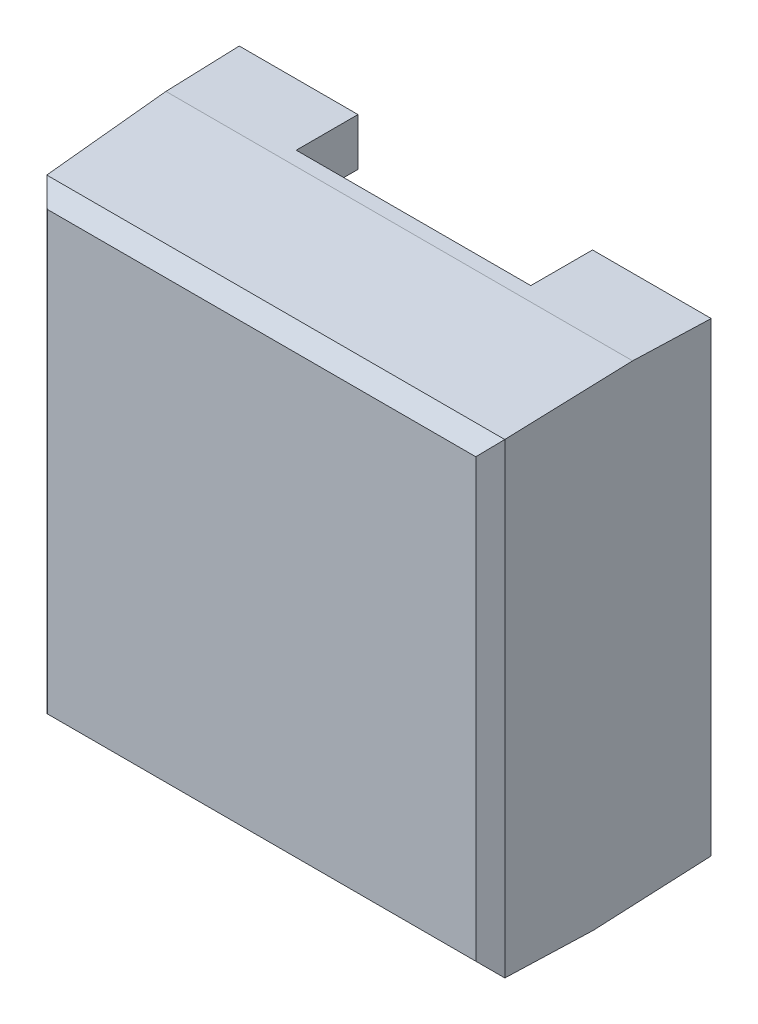
ISO-10303-21;
HEADER;
FILE_DESCRIPTION(('STEP AP214'),'2;1');
FILE_NAME('part.step','',(''),(''),'','','');
FILE_SCHEMA(('AUTOMOTIVE_DESIGN { 1 0 10303 214 1 1 1 1 }'));
ENDSEC;
DATA;
#1=APPLICATION_CONTEXT('core data for automotive mechanical design processes');
#2=APPLICATION_PROTOCOL_DEFINITION('international standard','automotive_design',2000,#1);
#3=PRODUCT_CONTEXT('',#1,'mechanical');
#4=PRODUCT('Part','Part','',(#3));
#5=PRODUCT_RELATED_PRODUCT_CATEGORY('part','',(#4));
#6=PRODUCT_DEFINITION_FORMATION('','',#4);
#7=PRODUCT_DEFINITION_CONTEXT('part definition',#1,'design');
#8=PRODUCT_DEFINITION('design','',#6,#7);
#9=PRODUCT_DEFINITION_SHAPE('','',#8);
#10=(LENGTH_UNIT() NAMED_UNIT(*) SI_UNIT(.MILLI.,.METRE.));
#11=(NAMED_UNIT(*) PLANE_ANGLE_UNIT() SI_UNIT($,.RADIAN.));
#12=(NAMED_UNIT(*) SI_UNIT($,.STERADIAN.) SOLID_ANGLE_UNIT());
#13=UNCERTAINTY_MEASURE_WITH_UNIT(LENGTH_MEASURE(1.E-05),#10,'distance_accuracy_value','');
#14=(GEOMETRIC_REPRESENTATION_CONTEXT(3) GLOBAL_UNCERTAINTY_ASSIGNED_CONTEXT((#13)) GLOBAL_UNIT_ASSIGNED_CONTEXT((#10,
#11,#12)) REPRESENTATION_CONTEXT('',''));
#15=CARTESIAN_POINT('',(0.,0.,0.));
#16=DIRECTION('',(0.,0.,1.));
#17=DIRECTION('',(1.,0.,0.));
#18=AXIS2_PLACEMENT_3D('',#15,#16,#17);
#19=CARTESIAN_POINT('',(0.,0.,4.5));
#20=DIRECTION('',(0.,1.,0.));
#21=DIRECTION('',(0.,0.,1.));
#22=AXIS2_PLACEMENT_3D('',#19,#20,#21);
#23=PLANE('',#22);
#24=DIRECTION('',(0.0348994967025091,0.,0.999390827019096));
#25=VECTOR('',#24,1.);
#26=CARTESIAN_POINT('',(0.187873739865646,0.,4.5));
#27=LINE('',#26,#25);
#28=CARTESIAN_POINT('',(0.17739750901812,0.,4.2));
#29=VERTEX_POINT('',#28);
#30=CARTESIAN_POINT('',(0.114540123932963,0.,2.4000000000001));
#31=VERTEX_POINT('',#30);
#32=EDGE_CURVE('E199',#29,#31,#27,.F.);
#33=ORIENTED_EDGE('',*,*,#32,.T.);
#34=DIRECTION('',(1.,0.,0.));
#35=VECTOR('',#34,1.);
#36=CARTESIAN_POINT('',(9.96926972284725,0.,2.4000000000001));
#37=LINE('',#36,#35);
#38=CARTESIAN_POINT('',(9.88545987606704,0.,2.4000000000001));
#39=VERTEX_POINT('',#38);
#40=EDGE_CURVE('E242',#31,#39,#37,.T.);
#41=ORIENTED_EDGE('',*,*,#40,.T.);
#42=DIRECTION('',(0.034899496702509,0.,-0.999390827019096));
#43=VECTOR('',#42,1.);
#44=CARTESIAN_POINT('',(9.81212626013435,0.,4.5));
#45=LINE('',#44,#43);
#46=CARTESIAN_POINT('',(9.82260249098188,0.,4.2));
#47=VERTEX_POINT('',#46);
#48=EDGE_CURVE('E197',#39,#47,#45,.F.);
#49=ORIENTED_EDGE('',*,*,#48,.T.);
#50=DIRECTION('',(-1.,0.,0.));
#51=VECTOR('',#50,1.);
#52=CARTESIAN_POINT('',(0.,0.,4.2));
#53=LINE('',#52,#51);
#54=EDGE_CURVE('E240',#47,#29,#53,.T.);
#55=ORIENTED_EDGE('',*,*,#54,.T.);
#56=EDGE_LOOP('',(#33,#41,#49,#55));
#57=FACE_BOUND('',#56,.T.);
#58=ADVANCED_FACE('F34',(#57),#23,.F.);
#59=CARTESIAN_POINT('',(0.,10.,4.5));
#60=DIRECTION('',(0.,-1.,0.));
#61=DIRECTION('',(0.,0.,-1.));
#62=AXIS2_PLACEMENT_3D('',#59,#60,#61);
#63=PLANE('',#62);
#64=DIRECTION('',(1.,0.,0.));
#65=VECTOR('',#64,1.);
#66=CARTESIAN_POINT('',(2.53073027715274,10.,1.3));
#67=LINE('',#66,#65);
#68=CARTESIAN_POINT('',(2.53073027715274,10.,1.3));
#69=VERTEX_POINT('',#68);
#70=CARTESIAN_POINT('',(7.46926972284725,10.,1.3));
#71=VERTEX_POINT('',#70);
#72=EDGE_CURVE('E169',#69,#71,#67,.T.);
#73=ORIENTED_EDGE('',*,*,#72,.F.);
#74=DIRECTION('',(0.,0.,-1.));
#75=VECTOR('',#74,1.);
#76=CARTESIAN_POINT('',(2.53073027715274,10.,1.3));
#77=LINE('',#76,#75);
#78=CARTESIAN_POINT('',(2.53073027715274,10.,0.));
#79=VERTEX_POINT('',#78);
#80=EDGE_CURVE('E246',#69,#79,#77,.T.);
#81=ORIENTED_EDGE('',*,*,#80,.T.);
#82=DIRECTION('',(-1.,0.,0.));
#83=VECTOR('',#82,1.);
#84=CARTESIAN_POINT('',(0.,10.,0.));
#85=LINE('',#84,#83);
#86=CARTESIAN_POINT('',(0.0307302771527434,10.,0.));
#87=VERTEX_POINT('',#86);
#88=EDGE_CURVE('E194',#79,#87,#85,.T.);
#89=ORIENTED_EDGE('',*,*,#88,.T.);
#90=DIRECTION('',(-0.0348994967025091,0.,-0.999390827019096));
#91=VECTOR('',#90,1.);
#92=CARTESIAN_POINT('',(0.187873739865645,10.,4.5));
#93=LINE('',#92,#91);
#94=CARTESIAN_POINT('',(0.0866035083395477,10.,1.59999999999986));
#95=VERTEX_POINT('',#94);
#96=EDGE_CURVE('E208',#87,#95,#93,.F.);
#97=ORIENTED_EDGE('',*,*,#96,.T.);
#98=DIRECTION('',(1.,0.,0.));
#99=VECTOR('',#98,1.);
#100=CARTESIAN_POINT('',(0.,10.,1.59999999999986));
#101=LINE('',#100,#99);
#102=CARTESIAN_POINT('',(9.91339649166045,10.,1.59999999999986));
#103=VERTEX_POINT('',#102);
#104=EDGE_CURVE('E193',#95,#103,#101,.T.);
#105=ORIENTED_EDGE('',*,*,#104,.T.);
#106=DIRECTION('',(-0.034899496702509,0.,0.999390827019096));
#107=VECTOR('',#106,1.);
#108=CARTESIAN_POINT('',(9.81212626013435,10.,4.5));
#109=LINE('',#108,#107);
#110=CARTESIAN_POINT('',(9.96926972284725,10.,0.));
#111=VERTEX_POINT('',#110);
#112=EDGE_CURVE('E206',#103,#111,#109,.F.);
#113=ORIENTED_EDGE('',*,*,#112,.T.);
#114=CARTESIAN_POINT('',(7.46926972284725,10.,0.));
#115=VERTEX_POINT('',#114);
#116=EDGE_CURVE('E184',#111,#115,#85,.T.);
#117=ORIENTED_EDGE('',*,*,#116,.T.);
#118=DIRECTION('',(0.,0.,-1.));
#119=VECTOR('',#118,1.);
#120=CARTESIAN_POINT('',(7.46926972284725,10.,1.3));
#121=LINE('',#120,#119);
#122=EDGE_CURVE('E162',#71,#115,#121,.T.);
#123=ORIENTED_EDGE('',*,*,#122,.F.);
#124=EDGE_LOOP('',(#73,#81,#89,#97,#105,#113,#117,#123));
#125=FACE_BOUND('',#124,.T.);
#126=ADVANCED_FACE('F182',(#125),#63,.F.);
#127=CARTESIAN_POINT('',(0.,0.,4.5));
#128=DIRECTION('',(0.,0.,-1.));
#129=DIRECTION('',(-1.,0.,0.));
#130=AXIS2_PLACEMENT_3D('',#127,#128,#129);
#131=PLANE('',#130);
#132=DIRECTION('',(-1.,0.,0.));
#133=VECTOR('',#132,1.);
#134=CARTESIAN_POINT('',(0.187873739865645,9.49999999999999,4.5));
#135=LINE('',#134,#133);
#136=CARTESIAN_POINT('',(9.51212626013435,9.49999999999999,4.5));
#137=VERTEX_POINT('',#136);
#138=CARTESIAN_POINT('',(0.487873739865643,9.49999999999999,4.5));
#139=VERTEX_POINT('',#138);
#140=EDGE_CURVE('E215',#137,#139,#135,.T.);
#141=ORIENTED_EDGE('',*,*,#140,.T.);
#142=DIRECTION('',(0.,-1.,0.));
#143=VECTOR('',#142,1.);
#144=CARTESIAN_POINT('',(0.487873739865645,0.,4.5));
#145=LINE('',#144,#143);
#146=CARTESIAN_POINT('',(0.487873739865645,0.300000000000002,4.5));
#147=VERTEX_POINT('',#146);
#148=EDGE_CURVE('E221',#139,#147,#145,.T.);
#149=ORIENTED_EDGE('',*,*,#148,.T.);
#150=DIRECTION('',(1.,0.,0.));
#151=VECTOR('',#150,1.);
#152=CARTESIAN_POINT('',(0.,0.300000000000002,4.5));
#153=LINE('',#152,#151);
#154=CARTESIAN_POINT('',(9.51212626013435,0.300000000000002,4.5));
#155=VERTEX_POINT('',#154);
#156=EDGE_CURVE('E219',#147,#155,#153,.T.);
#157=ORIENTED_EDGE('',*,*,#156,.T.);
#158=DIRECTION('',(0.,1.,0.));
#159=VECTOR('',#158,1.);
#160=CARTESIAN_POINT('',(9.51212626013435,9.8,4.5));
#161=LINE('',#160,#159);
#162=EDGE_CURVE('E217',#155,#137,#161,.T.);
#163=ORIENTED_EDGE('',*,*,#162,.T.);
#164=EDGE_LOOP('',(#141,#149,#157,#163));
#165=FACE_BOUND('',#164,.T.);
#166=ADVANCED_FACE('F286',(#165),#131,.F.);
#167=CARTESIAN_POINT('',(0.,0.,0.));
#168=DIRECTION('',(0.,0.,-1.));
#169=DIRECTION('',(-1.,0.,0.));
#170=AXIS2_PLACEMENT_3D('',#167,#168,#169);
#171=PLANE('',#170);
#172=DIRECTION('',(0.,1.,0.));
#173=VECTOR('',#172,1.);
#174=CARTESIAN_POINT('',(9.96926972284725,0.,0.));
#175=LINE('',#174,#173);
#176=CARTESIAN_POINT('',(9.96926972284725,0.2,0.));
#177=VERTEX_POINT('',#176);
#178=EDGE_CURVE('E202',#111,#177,#175,.F.);
#179=ORIENTED_EDGE('',*,*,#178,.T.);
#180=DIRECTION('',(-1.,0.,0.));
#181=VECTOR('',#180,1.);
#182=CARTESIAN_POINT('',(0.0307302771527443,0.2,0.));
#183=LINE('',#182,#181);
#184=CARTESIAN_POINT('',(0.0307302771527451,0.2,0.));
#185=VERTEX_POINT('',#184);
#186=EDGE_CURVE('E42',#177,#185,#183,.T.);
#187=ORIENTED_EDGE('',*,*,#186,.T.);
#188=DIRECTION('',(0.,-1.,0.));
#189=VECTOR('',#188,1.);
#190=CARTESIAN_POINT('',(0.0307302771527452,0.,0.));
#191=LINE('',#190,#189);
#192=EDGE_CURVE('E204',#185,#87,#191,.F.);
#193=ORIENTED_EDGE('',*,*,#192,.T.);
#194=ORIENTED_EDGE('',*,*,#88,.F.);
#195=DIRECTION('',(0.,1.,0.));
#196=VECTOR('',#195,1.);
#197=CARTESIAN_POINT('',(2.53073027715274,9.,0.));
#198=LINE('',#197,#196);
#199=CARTESIAN_POINT('',(2.53073027715274,9.,0.));
#200=VERTEX_POINT('',#199);
#201=EDGE_CURVE('E179',#200,#79,#198,.T.);
#202=ORIENTED_EDGE('',*,*,#201,.F.);
#203=DIRECTION('',(1.,0.,0.));
#204=VECTOR('',#203,1.);
#205=CARTESIAN_POINT('',(2.03073027715274,9.,0.));
#206=LINE('',#205,#204);
#207=CARTESIAN_POINT('',(2.03073027715274,9.,0.));
#208=VERTEX_POINT('',#207);
#209=EDGE_CURVE('E345',#208,#200,#206,.T.);
#210=ORIENTED_EDGE('',*,*,#209,.F.);
#211=DIRECTION('',(0.0995037190209989,0.995037190209989,0.));
#212=VECTOR('',#211,1.);
#213=CARTESIAN_POINT('',(1.53073027715274,4.,0.));
#214=LINE('',#213,#212);
#215=CARTESIAN_POINT('',(1.53073027715274,4.,0.));
#216=VERTEX_POINT('',#215);
#217=EDGE_CURVE('E342',#216,#208,#214,.T.);
#218=ORIENTED_EDGE('',*,*,#217,.F.);
#219=DIRECTION('',(-1.,0.,0.));
#220=VECTOR('',#219,1.);
#221=CARTESIAN_POINT('',(8.46926972284725,4.,0.));
#222=LINE('',#221,#220);
#223=CARTESIAN_POINT('',(8.46926972284725,4.,0.));
#224=VERTEX_POINT('',#223);
#225=EDGE_CURVE('E339',#224,#216,#222,.T.);
#226=ORIENTED_EDGE('',*,*,#225,.F.);
#227=DIRECTION('',(0.099503719020999,-0.995037190209989,0.));
#228=VECTOR('',#227,1.);
#229=CARTESIAN_POINT('',(7.96926972284725,9.,0.));
#230=LINE('',#229,#228);
#231=CARTESIAN_POINT('',(7.96926972284725,9.,0.));
#232=VERTEX_POINT('',#231);
#233=EDGE_CURVE('E333',#232,#224,#230,.T.);
#234=ORIENTED_EDGE('',*,*,#233,.F.);
#235=DIRECTION('',(1.,0.,0.));
#236=VECTOR('',#235,1.);
#237=CARTESIAN_POINT('',(7.46926972284725,9.,0.));
#238=LINE('',#237,#236);
#239=CARTESIAN_POINT('',(7.46926972284725,9.,0.));
#240=VERTEX_POINT('',#239);
#241=EDGE_CURVE('E331',#240,#232,#238,.T.);
#242=ORIENTED_EDGE('',*,*,#241,.F.);
#243=DIRECTION('',(0.,-1.,0.));
#244=VECTOR('',#243,1.);
#245=CARTESIAN_POINT('',(7.46926972284725,10.,0.));
#246=LINE('',#245,#244);
#247=EDGE_CURVE('E328',#115,#240,#246,.T.);
#248=ORIENTED_EDGE('',*,*,#247,.F.);
#249=ORIENTED_EDGE('',*,*,#116,.F.);
#250=EDGE_LOOP('',(#179,#187,#193,#194,#202,#210,#218,#226,#234,#242,#248,#249));
#251=FACE_BOUND('',#250,.T.);
#252=ADVANCED_FACE('F293',(#251),#171,.T.);
#253=CARTESIAN_POINT('',(0.,9.8,4.5));
#254=DIRECTION('',(0.,-0.997630328422983,-0.0688020916153749));
#255=DIRECTION('',(-1.,0.,0.));
#256=AXIS2_PLACEMENT_3D('',#253,#254,#255);
#257=PLANE('',#256);
#258=DIRECTION('',(0.0348168967267456,-0.0687603774615119,0.997025473191969));
#259=VECTOR('',#258,1.);
#260=CARTESIAN_POINT('',(0.187645996256273,9.800449774047,4.49347827631848));
#261=LINE('',#260,#259);
#262=CARTESIAN_POINT('',(0.177403890854892,9.8206770515935,4.20018275189427));
#263=VERTEX_POINT('',#262);
#264=EDGE_CURVE('E212',#95,#263,#261,.T.);
#265=ORIENTED_EDGE('',*,*,#264,.T.);
#266=DIRECTION('',(0.718515730818567,-0.0478525914326729,0.69386257577379));
#267=VECTOR('',#266,1.);
#268=CARTESIAN_POINT('',(0.236001674083989,9.81677448459399,4.25676997338719));
#269=LINE('',#268,#267);
#270=CARTESIAN_POINT('',(0.177950805753989,9.82064062748461,4.2007109014731));
#271=VERTEX_POINT('',#270);
#272=EDGE_CURVE('E233',#263,#271,#269,.T.);
#273=ORIENTED_EDGE('',*,*,#272,.T.);
#274=DIRECTION('',(-1.,0.,0.));
#275=VECTOR('',#274,1.);
#276=CARTESIAN_POINT('',(9.81212626013435,9.82064062748461,4.2007109014731));
#277=LINE('',#276,#275);
#278=CARTESIAN_POINT('',(9.82204919424601,9.82064062748461,4.2007109014731));
#279=VERTEX_POINT('',#278);
#280=EDGE_CURVE('E229',#271,#279,#277,.F.);
#281=ORIENTED_EDGE('',*,*,#280,.T.);
#282=DIRECTION('',(0.718515730818572,0.0478525914326725,-0.693862575773784));
#283=VECTOR('',#282,1.);
#284=CARTESIAN_POINT('',(4.60134977157854,9.47294608754589,9.24228173058476));
#285=LINE('',#284,#283);
#286=CARTESIAN_POINT('',(9.82259610914511,9.8206770515935,4.20018275189427));
#287=VERTEX_POINT('',#286);
#288=EDGE_CURVE('E231',#279,#287,#285,.T.);
#289=ORIENTED_EDGE('',*,*,#288,.T.);
#290=DIRECTION('',(0.0348168967267455,0.0687603774615119,-0.997025473191969));
#291=VECTOR('',#290,1.);
#292=CARTESIAN_POINT('',(9.80023184076691,9.77650954443731,4.84061160565907));
#293=LINE('',#292,#291);
#294=EDGE_CURVE('E210',#287,#103,#293,.T.);
#295=ORIENTED_EDGE('',*,*,#294,.T.);
#296=ORIENTED_EDGE('',*,*,#104,.F.);
#297=EDGE_LOOP('',(#265,#273,#281,#289,#295,#296));
#298=FACE_BOUND('',#297,.T.);
#299=ADVANCED_FACE('F290',(#298),#257,.F.);
#300=CARTESIAN_POINT('',(0.187873739865646,0.,4.5));
#301=DIRECTION('',(0.999390827019096,0.,-0.0348994967025091));
#302=DIRECTION('',(0.,-1.,0.));
#303=AXIS2_PLACEMENT_3D('',#300,#301,#302);
#304=PLANE('',#303);
#305=ORIENTED_EDGE('',*,*,#192,.F.);
#306=DIRECTION('',(-0.0347790914732437,0.0829952393647687,-0.995942872377267));
#307=VECTOR('',#306,1.);
#308=CARTESIAN_POINT('',(0.187368602536847,-0.173794563292472,4.48553475950985));
#309=LINE('',#308,#307);
#310=EDGE_CURVE('E11',#185,#31,#309,.F.);
#311=ORIENTED_EDGE('',*,*,#310,.T.);
#312=ORIENTED_EDGE('',*,*,#32,.F.);
#313=DIRECTION('',(0.0246851884078374,0.706891307583164,0.706891307583164));
#314=VECTOR('',#313,1.);
#315=CARTESIAN_POINT('',(0.18263881633218,0.15009140377901,4.35009140377901));
#316=LINE('',#315,#314);
#317=CARTESIAN_POINT('',(0.177403890854894,0.000182751894272157,4.20018275189427));
#318=VERTEX_POINT('',#317);
#319=EDGE_CURVE('E224',#29,#318,#316,.T.);
#320=ORIENTED_EDGE('',*,*,#319,.T.);
#321=DIRECTION('',(0.,-1.,0.));
#322=VECTOR('',#321,1.);
#323=CARTESIAN_POINT('',(0.177403890854892,9.8,4.20018275189427));
#324=LINE('',#323,#322);
#325=EDGE_CURVE('E226',#318,#263,#324,.F.);
#326=ORIENTED_EDGE('',*,*,#325,.T.);
#327=ORIENTED_EDGE('',*,*,#264,.F.);
#328=ORIENTED_EDGE('',*,*,#96,.F.);
#329=EDGE_LOOP('',(#305,#311,#312,#320,#326,#327,#328));
#330=FACE_BOUND('',#329,.T.);
#331=ADVANCED_FACE('F273',(#330),#304,.F.);
#332=CARTESIAN_POINT('',(9.81212626013435,0.,4.5));
#333=DIRECTION('',(-0.999390827019096,0.,-0.034899496702509));
#334=DIRECTION('',(0.,1.,0.));
#335=AXIS2_PLACEMENT_3D('',#332,#333,#334);
#336=PLANE('',#335);
#337=ORIENTED_EDGE('',*,*,#48,.F.);
#338=DIRECTION('',(-0.0347790914732436,-0.0829952393647687,0.995942872377267));
#339=VECTOR('',#338,1.);
#340=CARTESIAN_POINT('',(9.81263139746315,-0.173794563292472,4.48553475950985));
#341=LINE('',#340,#339);
#342=EDGE_CURVE('E56',#39,#177,#341,.F.);
#343=ORIENTED_EDGE('',*,*,#342,.T.);
#344=ORIENTED_EDGE('',*,*,#178,.F.);
#345=ORIENTED_EDGE('',*,*,#112,.F.);
#346=ORIENTED_EDGE('',*,*,#294,.F.);
#347=DIRECTION('',(0.,1.,0.));
#348=VECTOR('',#347,1.);
#349=CARTESIAN_POINT('',(9.82259610914511,0.,4.20018275189427));
#350=LINE('',#349,#348);
#351=CARTESIAN_POINT('',(9.82259610914511,0.000182751894272144,4.20018275189427));
#352=VERTEX_POINT('',#351);
#353=EDGE_CURVE('E235',#287,#352,#350,.F.);
#354=ORIENTED_EDGE('',*,*,#353,.T.);
#355=DIRECTION('',(0.0246851884078376,-0.706891307583164,-0.706891307583164));
#356=VECTOR('',#355,1.);
#357=CARTESIAN_POINT('',(9.81736118366782,0.150091403779011,4.35009140377901));
#358=LINE('',#357,#356);
#359=EDGE_CURVE('E237',#352,#47,#358,.T.);
#360=ORIENTED_EDGE('',*,*,#359,.T.);
#361=EDGE_LOOP('',(#337,#343,#344,#345,#346,#354,#360));
#362=FACE_BOUND('',#361,.T.);
#363=ADVANCED_FACE('F262',(#362),#336,.F.);
#364=CARTESIAN_POINT('',(9.51212626013435,0.,4.5));
#365=DIRECTION('',(-0.694658370458991,0.,-0.719339800338657));
#366=DIRECTION('',(0.,1.,0.));
#367=AXIS2_PLACEMENT_3D('',#364,#365,#366);
#368=PLANE('',#367);
#369=ORIENTED_EDGE('',*,*,#353,.F.);
#370=ORIENTED_EDGE('',*,*,#288,.F.);
#371=DIRECTION('',(0.577070043374536,0.597026165038574,-0.557270063164211));
#372=VECTOR('',#371,1.);
#373=CARTESIAN_POINT('',(6.34449466412558,6.22282599706407,7.55894627498984));
#374=LINE('',#373,#372);
#375=EDGE_CURVE('E252',#137,#279,#374,.T.);
#376=ORIENTED_EDGE('',*,*,#375,.F.);
#377=ORIENTED_EDGE('',*,*,#162,.F.);
#378=DIRECTION('',(0.590784889178383,-0.570514335805195,-0.570514335805195));
#379=VECTOR('',#378,1.);
#380=CARTESIAN_POINT('',(9.61324163473036,0.202354017792229,4.40235401779223));
#381=LINE('',#380,#379);
#382=EDGE_CURVE('E249',#352,#155,#381,.F.);
#383=ORIENTED_EDGE('',*,*,#382,.F.);
#384=EDGE_LOOP('',(#369,#370,#376,#377,#383));
#385=FACE_BOUND('',#384,.T.);
#386=ADVANCED_FACE('F299',(#385),#368,.F.);
#387=CARTESIAN_POINT('',(0.,9.49999999999999,4.5));
#388=DIRECTION('',(0.,-0.682348118039691,-0.731027390600169));
#389=DIRECTION('',(-1.,0.,0.));
#390=AXIS2_PLACEMENT_3D('',#387,#388,#389);
#391=PLANE('',#390);
#392=ORIENTED_EDGE('',*,*,#375,.T.);
#393=ORIENTED_EDGE('',*,*,#280,.F.);
#394=DIRECTION('',(0.57707004337453,-0.597026165038577,0.557270063164214));
#395=VECTOR('',#394,1.);
#396=CARTESIAN_POINT('',(0.32540698627153,9.6680851466095,4.34310767977482));
#397=LINE('',#396,#395);
#398=EDGE_CURVE('E245',#139,#271,#397,.F.);
#399=ORIENTED_EDGE('',*,*,#398,.F.);
#400=ORIENTED_EDGE('',*,*,#140,.F.);
#401=EDGE_LOOP('',(#392,#393,#399,#400));
#402=FACE_BOUND('',#401,.T.);
#403=ADVANCED_FACE('F307',(#402),#391,.F.);
#404=CARTESIAN_POINT('',(0.,0.300000000000002,4.5));
#405=DIRECTION('',(0.,0.707106781186548,-0.707106781186548));
#406=DIRECTION('',(1.,0.,0.));
#407=AXIS2_PLACEMENT_3D('',#404,#405,#406);
#408=PLANE('',#407);
#409=ORIENTED_EDGE('',*,*,#382,.T.);
#410=ORIENTED_EDGE('',*,*,#156,.F.);
#411=DIRECTION('',(-0.590784889178376,-0.570514335805199,-0.570514335805199));
#412=VECTOR('',#411,1.);
#413=CARTESIAN_POINT('',(0.317592736817073,0.135561546793107,4.3355615467931));
#414=LINE('',#413,#412);
#415=EDGE_CURVE('E243',#318,#147,#414,.F.);
#416=ORIENTED_EDGE('',*,*,#415,.F.);
#417=ORIENTED_EDGE('',*,*,#319,.F.);
#418=ORIENTED_EDGE('',*,*,#54,.F.);
#419=ORIENTED_EDGE('',*,*,#359,.F.);
#420=EDGE_LOOP('',(#409,#410,#416,#417,#418,#419));
#421=FACE_BOUND('',#420,.T.);
#422=ADVANCED_FACE('F270',(#421),#408,.F.);
#423=CARTESIAN_POINT('',(0.487873739865645,0.,4.5));
#424=DIRECTION('',(0.694658370458997,0.,-0.719339800338651));
#425=DIRECTION('',(0.,-1.,0.));
#426=AXIS2_PLACEMENT_3D('',#423,#424,#425);
#427=PLANE('',#426);
#428=ORIENTED_EDGE('',*,*,#272,.F.);
#429=ORIENTED_EDGE('',*,*,#325,.F.);
#430=ORIENTED_EDGE('',*,*,#415,.T.);
#431=ORIENTED_EDGE('',*,*,#148,.F.);
#432=ORIENTED_EDGE('',*,*,#398,.T.);
#433=EDGE_LOOP('',(#428,#429,#430,#431,#432));
#434=FACE_BOUND('',#433,.T.);
#435=ADVANCED_FACE('F300',(#434),#427,.F.);
#436=CARTESIAN_POINT('',(2.53073027715274,9.,1.3));
#437=DIRECTION('',(-1.,0.,0.));
#438=DIRECTION('',(0.,0.,1.));
#439=AXIS2_PLACEMENT_3D('',#436,#437,#438);
#440=PLANE('',#439);
#441=ORIENTED_EDGE('',*,*,#201,.T.);
#442=ORIENTED_EDGE('',*,*,#80,.F.);
#443=DIRECTION('',(0.,1.,0.));
#444=VECTOR('',#443,1.);
#445=CARTESIAN_POINT('',(2.53073027715274,9.,1.3));
#446=LINE('',#445,#444);
#447=CARTESIAN_POINT('',(2.53073027715274,9.,1.3));
#448=VERTEX_POINT('',#447);
#449=EDGE_CURVE('E176',#448,#69,#446,.T.);
#450=ORIENTED_EDGE('',*,*,#449,.F.);
#451=DIRECTION('',(0.,0.,-1.));
#452=VECTOR('',#451,1.);
#453=CARTESIAN_POINT('',(2.53073027715274,9.,1.3));
#454=LINE('',#453,#452);
#455=EDGE_CURVE('E350',#448,#200,#454,.T.);
#456=ORIENTED_EDGE('',*,*,#455,.T.);
#457=EDGE_LOOP('',(#441,#442,#450,#456));
#458=FACE_BOUND('',#457,.T.);
#459=ADVANCED_FACE('F303',(#458),#440,.F.);
#460=CARTESIAN_POINT('',(2.03073027715274,9.,1.3));
#461=DIRECTION('',(0.,1.,0.));
#462=DIRECTION('',(0.,0.,1.));
#463=AXIS2_PLACEMENT_3D('',#460,#461,#462);
#464=PLANE('',#463);
#465=ORIENTED_EDGE('',*,*,#209,.T.);
#466=ORIENTED_EDGE('',*,*,#455,.F.);
#467=DIRECTION('',(1.,0.,0.));
#468=VECTOR('',#467,1.);
#469=CARTESIAN_POINT('',(2.03073027715274,9.,1.3));
#470=LINE('',#469,#468);
#471=CARTESIAN_POINT('',(2.03073027715274,9.,1.3));
#472=VERTEX_POINT('',#471);
#473=EDGE_CURVE('E188',#472,#448,#470,.T.);
#474=ORIENTED_EDGE('',*,*,#473,.F.);
#475=DIRECTION('',(0.,0.,-1.));
#476=VECTOR('',#475,1.);
#477=CARTESIAN_POINT('',(2.03073027715274,9.,1.3));
#478=LINE('',#477,#476);
#479=EDGE_CURVE('E352',#472,#208,#478,.T.);
#480=ORIENTED_EDGE('',*,*,#479,.T.);
#481=EDGE_LOOP('',(#465,#466,#474,#480));
#482=FACE_BOUND('',#481,.T.);
#483=ADVANCED_FACE('F384',(#482),#464,.F.);
#484=CARTESIAN_POINT('',(1.53073027715274,4.,1.3));
#485=DIRECTION('',(-0.995037190209989,0.0995037190209989,0.));
#486=DIRECTION('',(-0.0995037190209989,-0.995037190209989,0.));
#487=AXIS2_PLACEMENT_3D('',#484,#485,#486);
#488=PLANE('',#487);
#489=ORIENTED_EDGE('',*,*,#217,.T.);
#490=ORIENTED_EDGE('',*,*,#479,.F.);
#491=DIRECTION('',(0.0995037190209989,0.995037190209989,0.));
#492=VECTOR('',#491,1.);
#493=CARTESIAN_POINT('',(1.53073027715274,4.,1.3));
#494=LINE('',#493,#492);
#495=CARTESIAN_POINT('',(1.53073027715274,4.,1.3));
#496=VERTEX_POINT('',#495);
#497=EDGE_CURVE('E374',#496,#472,#494,.T.);
#498=ORIENTED_EDGE('',*,*,#497,.F.);
#499=DIRECTION('',(0.,0.,-1.));
#500=VECTOR('',#499,1.);
#501=CARTESIAN_POINT('',(1.53073027715274,4.,1.3));
#502=LINE('',#501,#500);
#503=EDGE_CURVE('E354',#496,#216,#502,.T.);
#504=ORIENTED_EDGE('',*,*,#503,.T.);
#505=EDGE_LOOP('',(#489,#490,#498,#504));
#506=FACE_BOUND('',#505,.T.);
#507=ADVANCED_FACE('F386',(#506),#488,.F.);
#508=CARTESIAN_POINT('',(8.46926972284725,4.,1.3));
#509=DIRECTION('',(0.,-1.,0.));
#510=DIRECTION('',(0.,0.,-1.));
#511=AXIS2_PLACEMENT_3D('',#508,#509,#510);
#512=PLANE('',#511);
#513=ORIENTED_EDGE('',*,*,#225,.T.);
#514=ORIENTED_EDGE('',*,*,#503,.F.);
#515=DIRECTION('',(-1.,0.,0.));
#516=VECTOR('',#515,1.);
#517=CARTESIAN_POINT('',(8.46926972284725,4.,1.3));
#518=LINE('',#517,#516);
#519=CARTESIAN_POINT('',(8.46926972284725,4.,1.3));
#520=VERTEX_POINT('',#519);
#521=EDGE_CURVE('E372',#520,#496,#518,.T.);
#522=ORIENTED_EDGE('',*,*,#521,.F.);
#523=DIRECTION('',(0.,0.,-1.));
#524=VECTOR('',#523,1.);
#525=CARTESIAN_POINT('',(8.46926972284725,4.,1.3));
#526=LINE('',#525,#524);
#527=EDGE_CURVE('E356',#520,#224,#526,.T.);
#528=ORIENTED_EDGE('',*,*,#527,.T.);
#529=EDGE_LOOP('',(#513,#514,#522,#528));
#530=FACE_BOUND('',#529,.T.);
#531=ADVANCED_FACE('F368',(#530),#512,.F.);
#532=CARTESIAN_POINT('',(7.96926972284725,9.,1.3));
#533=DIRECTION('',(0.995037190209989,0.099503719020999,0.));
#534=DIRECTION('',(-0.099503719020999,0.995037190209989,0.));
#535=AXIS2_PLACEMENT_3D('',#532,#533,#534);
#536=PLANE('',#535);
#537=ORIENTED_EDGE('',*,*,#233,.T.);
#538=ORIENTED_EDGE('',*,*,#527,.F.);
#539=DIRECTION('',(0.099503719020999,-0.995037190209989,0.));
#540=VECTOR('',#539,1.);
#541=CARTESIAN_POINT('',(7.96926972284725,9.,1.3));
#542=LINE('',#541,#540);
#543=CARTESIAN_POINT('',(7.96926972284725,9.,1.3));
#544=VERTEX_POINT('',#543);
#545=EDGE_CURVE('E362',#544,#520,#542,.T.);
#546=ORIENTED_EDGE('',*,*,#545,.F.);
#547=DIRECTION('',(0.,0.,-1.));
#548=VECTOR('',#547,1.);
#549=CARTESIAN_POINT('',(7.96926972284725,9.,1.3));
#550=LINE('',#549,#548);
#551=EDGE_CURVE('E186',#544,#232,#550,.T.);
#552=ORIENTED_EDGE('',*,*,#551,.T.);
#553=EDGE_LOOP('',(#537,#538,#546,#552));
#554=FACE_BOUND('',#553,.T.);
#555=ADVANCED_FACE('F359',(#554),#536,.F.);
#556=CARTESIAN_POINT('',(7.46926972284725,9.,1.3));
#557=DIRECTION('',(0.,1.,0.));
#558=DIRECTION('',(0.,0.,1.));
#559=AXIS2_PLACEMENT_3D('',#556,#557,#558);
#560=PLANE('',#559);
#561=ORIENTED_EDGE('',*,*,#241,.T.);
#562=ORIENTED_EDGE('',*,*,#551,.F.);
#563=DIRECTION('',(1.,0.,0.));
#564=VECTOR('',#563,1.);
#565=CARTESIAN_POINT('',(7.46926972284725,9.,1.3));
#566=LINE('',#565,#564);
#567=CARTESIAN_POINT('',(7.46926972284725,9.,1.3));
#568=VERTEX_POINT('',#567);
#569=EDGE_CURVE('E168',#568,#544,#566,.T.);
#570=ORIENTED_EDGE('',*,*,#569,.F.);
#571=DIRECTION('',(0.,0.,-1.));
#572=VECTOR('',#571,1.);
#573=CARTESIAN_POINT('',(7.46926972284725,9.,1.3));
#574=LINE('',#573,#572);
#575=EDGE_CURVE('E164',#568,#240,#574,.T.);
#576=ORIENTED_EDGE('',*,*,#575,.T.);
#577=EDGE_LOOP('',(#561,#562,#570,#576));
#578=FACE_BOUND('',#577,.T.);
#579=ADVANCED_FACE('F364',(#578),#560,.F.);
#580=CARTESIAN_POINT('',(7.46926972284725,10.,1.3));
#581=DIRECTION('',(1.,0.,0.));
#582=DIRECTION('',(0.,0.,-1.));
#583=AXIS2_PLACEMENT_3D('',#580,#581,#582);
#584=PLANE('',#583);
#585=ORIENTED_EDGE('',*,*,#247,.T.);
#586=ORIENTED_EDGE('',*,*,#575,.F.);
#587=DIRECTION('',(0.,-1.,0.));
#588=VECTOR('',#587,1.);
#589=CARTESIAN_POINT('',(7.46926972284725,10.,1.3));
#590=LINE('',#589,#588);
#591=EDGE_CURVE('E157',#71,#568,#590,.T.);
#592=ORIENTED_EDGE('',*,*,#591,.F.);
#593=ORIENTED_EDGE('',*,*,#122,.T.);
#594=EDGE_LOOP('',(#585,#586,#592,#593));
#595=FACE_BOUND('',#594,.T.);
#596=ADVANCED_FACE('F160',(#595),#584,.F.);
#597=CARTESIAN_POINT('',(0.,0.,1.3));
#598=DIRECTION('',(0.,0.,-1.));
#599=DIRECTION('',(-1.,0.,0.));
#600=AXIS2_PLACEMENT_3D('',#597,#598,#599);
#601=PLANE('',#600);
#602=ORIENTED_EDGE('',*,*,#72,.T.);
#603=ORIENTED_EDGE('',*,*,#591,.T.);
#604=ORIENTED_EDGE('',*,*,#569,.T.);
#605=ORIENTED_EDGE('',*,*,#545,.T.);
#606=ORIENTED_EDGE('',*,*,#521,.T.);
#607=ORIENTED_EDGE('',*,*,#497,.T.);
#608=ORIENTED_EDGE('',*,*,#473,.T.);
#609=ORIENTED_EDGE('',*,*,#449,.T.);
#610=EDGE_LOOP('',(#602,#603,#604,#605,#606,#607,#608,#609));
#611=FACE_BOUND('',#610,.T.);
#612=ADVANCED_FACE('F173',(#611),#601,.T.);
#613=CARTESIAN_POINT('',(0.,0.,2.4000000000001));
#614=DIRECTION('',(0.,-0.99654575824488,-0.0830454798537365));
#615=DIRECTION('',(-1.,0.,0.));
#616=AXIS2_PLACEMENT_3D('',#613,#614,#615);
#617=PLANE('',#616);
#618=ORIENTED_EDGE('',*,*,#310,.F.);
#619=ORIENTED_EDGE('',*,*,#186,.F.);
#620=ORIENTED_EDGE('',*,*,#342,.F.);
#621=ORIENTED_EDGE('',*,*,#40,.F.);
#622=EDGE_LOOP('',(#618,#619,#620,#621));
#623=FACE_BOUND('',#622,.T.);
#624=ADVANCED_FACE('F36',(#623),#617,.T.);
#625=CLOSED_SHELL('',(#58,#126,#166,#252,#299,#331,#363,#386,#403,#422,#435,#459,#483,#507,#531,
#555,#579,#596,#612,#624));
#626=MANIFOLD_SOLID_BREP('B2',#625);
#627=ADVANCED_BREP_SHAPE_REPRESENTATION('',(#18,#626),#14);
#628=SHAPE_DEFINITION_REPRESENTATION(#9,#627);
ENDSEC;
END-ISO-10303-21;
